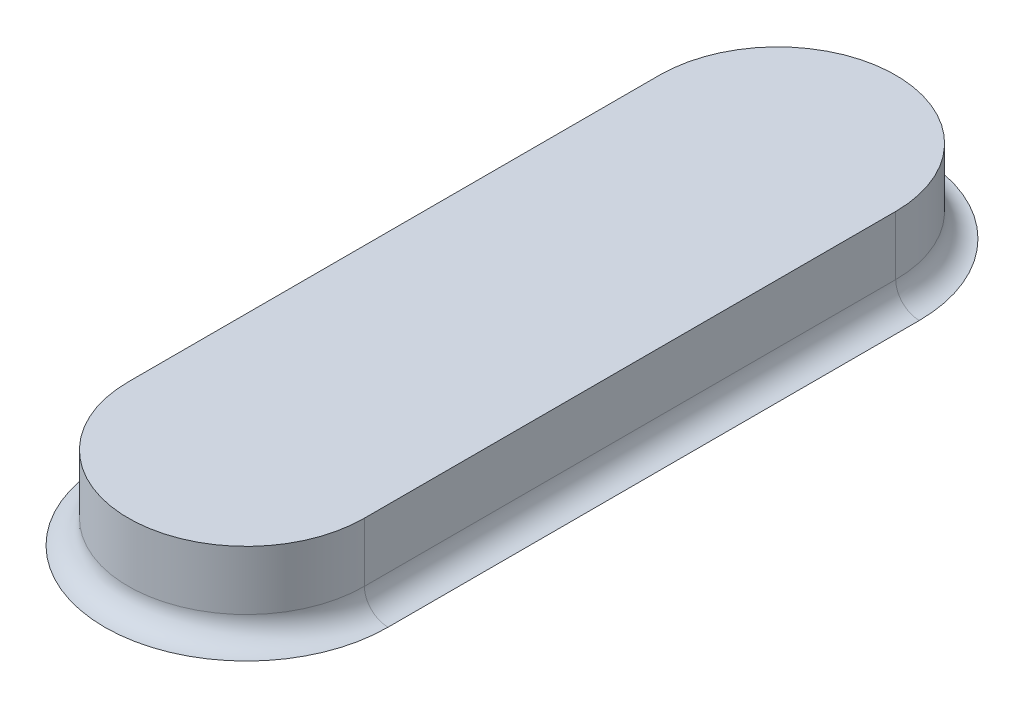
ISO-10303-21;
HEADER;
FILE_DESCRIPTION(('STEP AP214'),'2;1');
FILE_NAME('part.step','',(''),(''),'','','');
FILE_SCHEMA(('AUTOMOTIVE_DESIGN { 1 0 10303 214 1 1 1 1 }'));
ENDSEC;
DATA;
#1=APPLICATION_CONTEXT('core data for automotive mechanical design processes');
#2=APPLICATION_PROTOCOL_DEFINITION('international standard','automotive_design',2000,#1);
#3=PRODUCT_CONTEXT('',#1,'mechanical');
#4=PRODUCT('Part','Part','',(#3));
#5=PRODUCT_RELATED_PRODUCT_CATEGORY('part','',(#4));
#6=PRODUCT_DEFINITION_FORMATION('','',#4);
#7=PRODUCT_DEFINITION_CONTEXT('part definition',#1,'design');
#8=PRODUCT_DEFINITION('design','',#6,#7);
#9=PRODUCT_DEFINITION_SHAPE('','',#8);
#10=(LENGTH_UNIT() NAMED_UNIT(*) SI_UNIT(.MILLI.,.METRE.));
#11=(NAMED_UNIT(*) PLANE_ANGLE_UNIT() SI_UNIT($,.RADIAN.));
#12=(NAMED_UNIT(*) SI_UNIT($,.STERADIAN.) SOLID_ANGLE_UNIT());
#13=UNCERTAINTY_MEASURE_WITH_UNIT(LENGTH_MEASURE(1.E-05),#10,'distance_accuracy_value','');
#14=(GEOMETRIC_REPRESENTATION_CONTEXT(3) GLOBAL_UNCERTAINTY_ASSIGNED_CONTEXT((#13)) GLOBAL_UNIT_ASSIGNED_CONTEXT((#10,
#11,#12)) REPRESENTATION_CONTEXT('',''));
#15=CARTESIAN_POINT('',(0.,0.,0.));
#16=DIRECTION('',(0.,0.,1.));
#17=DIRECTION('',(1.,0.,0.));
#18=AXIS2_PLACEMENT_3D('',#15,#16,#17);
#19=CARTESIAN_POINT('',(-13.,10.,-18.01));
#20=DIRECTION('',(0.,-1.,0.));
#21=DIRECTION('',(0.,0.,-1.));
#22=AXIS2_PLACEMENT_3D('',#19,#20,#21);
#23=PLANE('',#22);
#24=DIRECTION('',(0.,0.,1.));
#25=VECTOR('',#24,1.);
#26=CARTESIAN_POINT('',(-12.,10.,-18.));
#27=LINE('',#26,#25);
#28=CARTESIAN_POINT('',(-12.,10.,4.5));
#29=VERTEX_POINT('',#28);
#30=CARTESIAN_POINT('',(-12.,10.,-40.5));
#31=VERTEX_POINT('',#30);
#32=EDGE_CURVE('E111',#29,#31,#27,.F.);
#33=ORIENTED_EDGE('',*,*,#32,.T.);
#34=CARTESIAN_POINT('',(0.,10.,-40.5));
#35=DIRECTION('',(0.,1.,0.));
#36=DIRECTION('',(0.,0.,1.));
#37=AXIS2_PLACEMENT_3D('',#34,#35,#36);
#38=CIRCLE('',#37,12.);
#39=CARTESIAN_POINT('',(12.,10.,-40.5));
#40=VERTEX_POINT('',#39);
#41=EDGE_CURVE('E104',#40,#31,#38,.T.);
#42=ORIENTED_EDGE('',*,*,#41,.F.);
#43=DIRECTION('',(0.,0.,-1.));
#44=VECTOR('',#43,1.);
#45=CARTESIAN_POINT('',(12.,10.,4.49999999999999));
#46=LINE('',#45,#44);
#47=CARTESIAN_POINT('',(12.,10.,4.49999999999999));
#48=VERTEX_POINT('',#47);
#49=EDGE_CURVE('E39',#40,#48,#46,.F.);
#50=ORIENTED_EDGE('',*,*,#49,.T.);
#51=CARTESIAN_POINT('',(0.,10.,4.5));
#52=DIRECTION('',(0.,-1.,0.));
#53=DIRECTION('',(0.,0.,-1.));
#54=AXIS2_PLACEMENT_3D('',#51,#52,#53);
#55=CIRCLE('',#54,12.);
#56=EDGE_CURVE('E98',#48,#29,#55,.T.);
#57=ORIENTED_EDGE('',*,*,#56,.T.);
#58=EDGE_LOOP('',(#33,#42,#50,#57));
#59=FACE_BOUND('',#58,.T.);
#60=ADVANCED_FACE('F36',(#59),#23,.T.);
#61=CARTESIAN_POINT('',(0.,17.,4.5));
#62=DIRECTION('',(0.,-1.,0.));
#63=DIRECTION('',(0.,0.,-1.));
#64=AXIS2_PLACEMENT_3D('',#61,#62,#63);
#65=PLANE('',#64);
#66=DIRECTION('',(0.,0.,-1.));
#67=VECTOR('',#66,1.);
#68=CARTESIAN_POINT('',(10.,17.,-18.));
#69=LINE('',#68,#67);
#70=CARTESIAN_POINT('',(10.,17.,4.49999999999999));
#71=VERTEX_POINT('',#70);
#72=CARTESIAN_POINT('',(9.99999999999999,17.,-40.5));
#73=VERTEX_POINT('',#72);
#74=EDGE_CURVE('E133',#71,#73,#69,.T.);
#75=ORIENTED_EDGE('',*,*,#74,.T.);
#76=CARTESIAN_POINT('',(0.,17.,-40.5));
#77=DIRECTION('',(0.,-1.,0.));
#78=DIRECTION('',(0.,0.,1.));
#79=AXIS2_PLACEMENT_3D('',#76,#77,#78);
#80=CIRCLE('',#79,10.);
#81=CARTESIAN_POINT('',(-10.,17.,-40.5));
#82=VERTEX_POINT('',#81);
#83=EDGE_CURVE('E108',#82,#73,#80,.T.);
#84=ORIENTED_EDGE('',*,*,#83,.F.);
#85=DIRECTION('',(0.,0.,1.));
#86=VECTOR('',#85,1.);
#87=CARTESIAN_POINT('',(-10.,17.,4.5));
#88=LINE('',#87,#86);
#89=CARTESIAN_POINT('',(-10.,17.,4.5));
#90=VERTEX_POINT('',#89);
#91=EDGE_CURVE('E52',#82,#90,#88,.T.);
#92=ORIENTED_EDGE('',*,*,#91,.T.);
#93=CARTESIAN_POINT('',(0.,17.,4.5));
#94=DIRECTION('',(0.,1.,0.));
#95=DIRECTION('',(0.,0.,-1.));
#96=AXIS2_PLACEMENT_3D('',#93,#94,#95);
#97=CIRCLE('',#96,10.);
#98=EDGE_CURVE('E57',#90,#71,#97,.T.);
#99=ORIENTED_EDGE('',*,*,#98,.T.);
#100=EDGE_LOOP('',(#75,#84,#92,#99));
#101=FACE_BOUND('',#100,.T.);
#102=ADVANCED_FACE('F151',(#101),#65,.F.);
#103=CARTESIAN_POINT('',(10.,17.,-18.));
#104=DIRECTION('',(-1.,0.,0.));
#105=DIRECTION('',(0.,0.,1.));
#106=AXIS2_PLACEMENT_3D('',#103,#104,#105);
#107=PLANE('',#106);
#108=DIRECTION('',(0.,-1.,0.));
#109=VECTOR('',#108,1.);
#110=CARTESIAN_POINT('',(10.,17.,4.49999999999999));
#111=LINE('',#110,#109);
#112=CARTESIAN_POINT('',(10.,12.,4.49999999999999));
#113=VERTEX_POINT('',#112);
#114=EDGE_CURVE('E130',#71,#113,#111,.T.);
#115=ORIENTED_EDGE('',*,*,#114,.T.);
#116=DIRECTION('',(0.,0.,-1.));
#117=VECTOR('',#116,1.);
#118=CARTESIAN_POINT('',(10.,12.,-18.));
#119=LINE('',#118,#117);
#120=CARTESIAN_POINT('',(9.99999999999999,12.,-40.5));
#121=VERTEX_POINT('',#120);
#122=EDGE_CURVE('E120',#113,#121,#119,.T.);
#123=ORIENTED_EDGE('',*,*,#122,.T.);
#124=DIRECTION('',(0.,-1.,0.));
#125=VECTOR('',#124,1.);
#126=CARTESIAN_POINT('',(9.99999999999999,17.,-40.5));
#127=LINE('',#126,#125);
#128=EDGE_CURVE('E145',#73,#121,#127,.T.);
#129=ORIENTED_EDGE('',*,*,#128,.F.);
#130=ORIENTED_EDGE('',*,*,#74,.F.);
#131=EDGE_LOOP('',(#115,#123,#129,#130));
#132=FACE_BOUND('',#131,.T.);
#133=ADVANCED_FACE('F154',(#132),#107,.F.);
#134=CARTESIAN_POINT('',(0.,17.,4.5));
#135=DIRECTION('',(0.,-1.,0.));
#136=DIRECTION('',(0.,0.,-1.));
#137=AXIS2_PLACEMENT_3D('',#134,#135,#136);
#138=CYLINDRICAL_SURFACE('',#137,10.);
#139=DIRECTION('',(0.,-1.,0.));
#140=VECTOR('',#139,1.);
#141=CARTESIAN_POINT('',(-10.,17.,4.5));
#142=LINE('',#141,#140);
#143=CARTESIAN_POINT('',(-10.,12.,4.5));
#144=VERTEX_POINT('',#143);
#145=EDGE_CURVE('E127',#90,#144,#142,.T.);
#146=ORIENTED_EDGE('',*,*,#145,.T.);
#147=CARTESIAN_POINT('',(0.,12.,4.5));
#148=DIRECTION('',(0.,-1.,0.));
#149=DIRECTION('',(0.,0.,-1.));
#150=AXIS2_PLACEMENT_3D('',#147,#148,#149);
#151=CIRCLE('',#150,10.);
#152=EDGE_CURVE('E122',#144,#113,#151,.F.);
#153=ORIENTED_EDGE('',*,*,#152,.T.);
#154=ORIENTED_EDGE('',*,*,#114,.F.);
#155=ORIENTED_EDGE('',*,*,#98,.F.);
#156=EDGE_LOOP('',(#146,#153,#154,#155));
#157=FACE_BOUND('',#156,.T.);
#158=ADVANCED_FACE('F156',(#157),#138,.T.);
#159=CARTESIAN_POINT('',(12.,12.,-18.));
#160=DIRECTION('',(0.,0.,1.));
#161=DIRECTION('',(1.,0.,0.));
#162=AXIS2_PLACEMENT_3D('',#159,#160,#161);
#163=CYLINDRICAL_SURFACE('',#162,2.);
#164=ORIENTED_EDGE('',*,*,#49,.F.);
#165=CARTESIAN_POINT('',(12.,12.,-40.5));
#166=DIRECTION('',(0.,0.,-1.));
#167=DIRECTION('',(-1.,0.,0.));
#168=AXIS2_PLACEMENT_3D('',#165,#166,#167);
#169=CIRCLE('',#168,2.);
#170=EDGE_CURVE('E91',#40,#121,#169,.T.);
#171=ORIENTED_EDGE('',*,*,#170,.T.);
#172=ORIENTED_EDGE('',*,*,#122,.F.);
#173=CARTESIAN_POINT('',(12.,12.,4.49999999999999));
#174=DIRECTION('',(0.,0.,-1.));
#175=DIRECTION('',(-1.,0.,0.));
#176=AXIS2_PLACEMENT_3D('',#173,#174,#175);
#177=CIRCLE('',#176,2.);
#178=EDGE_CURVE('E44',#48,#113,#177,.T.);
#179=ORIENTED_EDGE('',*,*,#178,.F.);
#180=EDGE_LOOP('',(#164,#171,#172,#179));
#181=FACE_BOUND('',#180,.T.);
#182=ADVANCED_FACE('F89',(#181),#163,.F.);
#183=CARTESIAN_POINT('',(-10.,17.,4.5));
#184=DIRECTION('',(1.,0.,0.));
#185=DIRECTION('',(0.,0.,-1.));
#186=AXIS2_PLACEMENT_3D('',#183,#184,#185);
#187=PLANE('',#186);
#188=ORIENTED_EDGE('',*,*,#91,.F.);
#189=DIRECTION('',(0.,-1.,0.));
#190=VECTOR('',#189,1.);
#191=CARTESIAN_POINT('',(-10.,17.,-40.5));
#192=LINE('',#191,#190);
#193=CARTESIAN_POINT('',(-10.,12.,-40.5));
#194=VERTEX_POINT('',#193);
#195=EDGE_CURVE('E114',#82,#194,#192,.T.);
#196=ORIENTED_EDGE('',*,*,#195,.T.);
#197=DIRECTION('',(0.,0.,1.));
#198=VECTOR('',#197,1.);
#199=CARTESIAN_POINT('',(-10.,12.,4.5));
#200=LINE('',#199,#198);
#201=EDGE_CURVE('E124',#194,#144,#200,.T.);
#202=ORIENTED_EDGE('',*,*,#201,.T.);
#203=ORIENTED_EDGE('',*,*,#145,.F.);
#204=EDGE_LOOP('',(#188,#196,#202,#203));
#205=FACE_BOUND('',#204,.T.);
#206=ADVANCED_FACE('F158',(#205),#187,.F.);
#207=CARTESIAN_POINT('',(0.,12.,4.5));
#208=DIRECTION('',(0.,-1.,0.));
#209=DIRECTION('',(0.,0.,-1.));
#210=AXIS2_PLACEMENT_3D('',#207,#208,#209);
#211=TOROIDAL_SURFACE('',#210,12.,2.);
#212=ORIENTED_EDGE('',*,*,#178,.T.);
#213=ORIENTED_EDGE('',*,*,#152,.F.);
#214=CARTESIAN_POINT('',(-12.,12.,4.5));
#215=DIRECTION('',(0.,0.,1.));
#216=DIRECTION('',(1.,0.,0.));
#217=AXIS2_PLACEMENT_3D('',#214,#215,#216);
#218=CIRCLE('',#217,2.);
#219=EDGE_CURVE('E12',#29,#144,#218,.T.);
#220=ORIENTED_EDGE('',*,*,#219,.F.);
#221=ORIENTED_EDGE('',*,*,#56,.F.);
#222=EDGE_LOOP('',(#212,#213,#220,#221));
#223=FACE_BOUND('',#222,.T.);
#224=ADVANCED_FACE('F138',(#223),#211,.F.);
#225=CARTESIAN_POINT('',(-12.,12.,4.5));
#226=DIRECTION('',(0.,0.,-1.));
#227=DIRECTION('',(-1.,0.,0.));
#228=AXIS2_PLACEMENT_3D('',#225,#226,#227);
#229=CYLINDRICAL_SURFACE('',#228,2.);
#230=ORIENTED_EDGE('',*,*,#201,.F.);
#231=CARTESIAN_POINT('',(-12.,12.,-40.5));
#232=DIRECTION('',(0.,0.,1.));
#233=DIRECTION('',(1.,0.,0.));
#234=AXIS2_PLACEMENT_3D('',#231,#232,#233);
#235=CIRCLE('',#234,2.);
#236=EDGE_CURVE('E99',#31,#194,#235,.T.);
#237=ORIENTED_EDGE('',*,*,#236,.F.);
#238=ORIENTED_EDGE('',*,*,#32,.F.);
#239=ORIENTED_EDGE('',*,*,#219,.T.);
#240=EDGE_LOOP('',(#230,#237,#238,#239));
#241=FACE_BOUND('',#240,.T.);
#242=ADVANCED_FACE('F141',(#241),#229,.F.);
#243=CARTESIAN_POINT('',(0.,17.,-40.5));
#244=DIRECTION('',(0.,-1.,0.));
#245=DIRECTION('',(0.,0.,1.));
#246=AXIS2_PLACEMENT_3D('',#243,#244,#245);
#247=CYLINDRICAL_SURFACE('',#246,10.);
#248=ORIENTED_EDGE('',*,*,#195,.F.);
#249=ORIENTED_EDGE('',*,*,#83,.T.);
#250=ORIENTED_EDGE('',*,*,#128,.T.);
#251=CARTESIAN_POINT('',(0.,12.,-40.5));
#252=DIRECTION('',(0.,1.,0.));
#253=DIRECTION('',(0.,0.,1.));
#254=AXIS2_PLACEMENT_3D('',#251,#252,#253);
#255=CIRCLE('',#254,10.);
#256=EDGE_CURVE('E106',#194,#121,#255,.F.);
#257=ORIENTED_EDGE('',*,*,#256,.F.);
#258=EDGE_LOOP('',(#248,#249,#250,#257));
#259=FACE_BOUND('',#258,.T.);
#260=ADVANCED_FACE('F150',(#259),#247,.T.);
#261=CARTESIAN_POINT('',(0.,12.,-40.5));
#262=DIRECTION('',(0.,-1.,0.));
#263=DIRECTION('',(0.,0.,1.));
#264=AXIS2_PLACEMENT_3D('',#261,#262,#263);
#265=TOROIDAL_SURFACE('',#264,12.,2.);
#266=ORIENTED_EDGE('',*,*,#170,.F.);
#267=ORIENTED_EDGE('',*,*,#41,.T.);
#268=ORIENTED_EDGE('',*,*,#236,.T.);
#269=ORIENTED_EDGE('',*,*,#256,.T.);
#270=EDGE_LOOP('',(#266,#267,#268,#269));
#271=FACE_BOUND('',#270,.T.);
#272=ADVANCED_FACE('F102',(#271),#265,.F.);
#273=CLOSED_SHELL('',(#60,#102,#133,#158,#182,#206,#224,#242,#260,#272));
#274=MANIFOLD_SOLID_BREP('B2',#273);
#275=ADVANCED_BREP_SHAPE_REPRESENTATION('',(#18,#274),#14);
#276=SHAPE_DEFINITION_REPRESENTATION(#9,#275);
ENDSEC;
END-ISO-10303-21;
